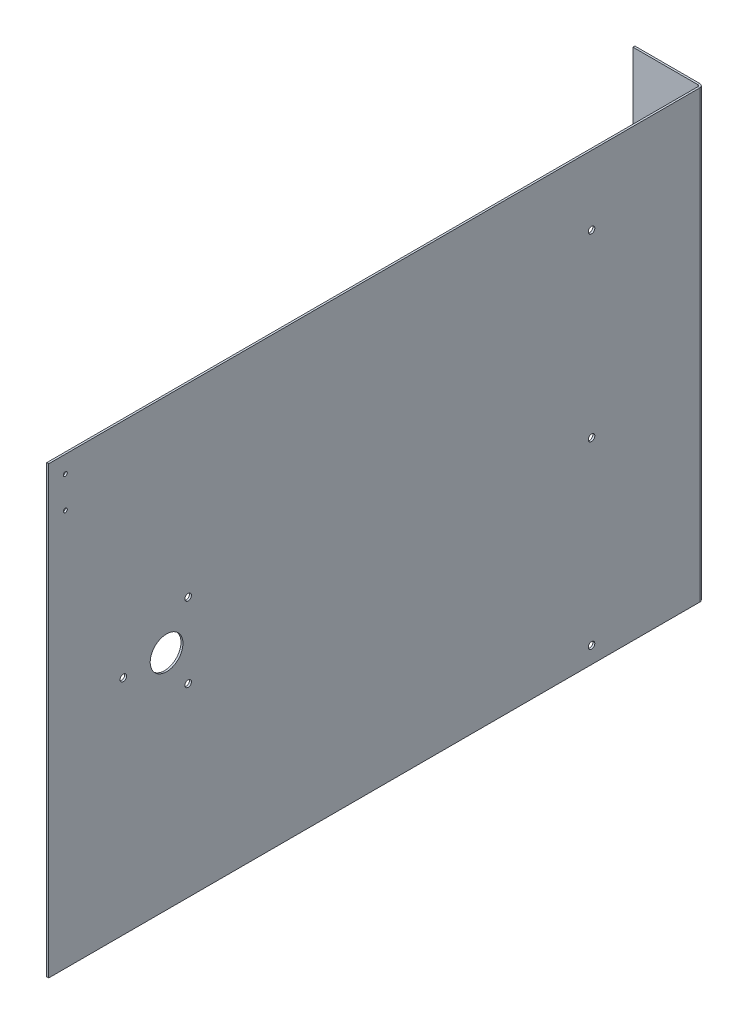
ISO-10303-21;
HEADER;
FILE_DESCRIPTION(('STEP AP214'),'2;1');
FILE_NAME('part.step','',(''),(''),'','','');
FILE_SCHEMA(('AUTOMOTIVE_DESIGN { 1 0 10303 214 1 1 1 1 }'));
ENDSEC;
DATA;
#1=APPLICATION_CONTEXT('core data for automotive mechanical design processes');
#2=APPLICATION_PROTOCOL_DEFINITION('international standard','automotive_design',2000,#1);
#3=PRODUCT_CONTEXT('',#1,'mechanical');
#4=PRODUCT('Part','Part','',(#3));
#5=PRODUCT_RELATED_PRODUCT_CATEGORY('part','',(#4));
#6=PRODUCT_DEFINITION_FORMATION('','',#4);
#7=PRODUCT_DEFINITION_CONTEXT('part definition',#1,'design');
#8=PRODUCT_DEFINITION('design','',#6,#7);
#9=PRODUCT_DEFINITION_SHAPE('','',#8);
#10=(LENGTH_UNIT() NAMED_UNIT(*) SI_UNIT(.MILLI.,.METRE.));
#11=(NAMED_UNIT(*) PLANE_ANGLE_UNIT() SI_UNIT($,.RADIAN.));
#12=(NAMED_UNIT(*) SI_UNIT($,.STERADIAN.) SOLID_ANGLE_UNIT());
#13=UNCERTAINTY_MEASURE_WITH_UNIT(LENGTH_MEASURE(1.E-05),#10,'distance_accuracy_value','');
#14=(GEOMETRIC_REPRESENTATION_CONTEXT(3) GLOBAL_UNCERTAINTY_ASSIGNED_CONTEXT((#13)) GLOBAL_UNIT_ASSIGNED_CONTEXT((#10,
#11,#12)) REPRESENTATION_CONTEXT('',''));
#15=CARTESIAN_POINT('',(0.,0.,0.));
#16=DIRECTION('',(0.,0.,1.));
#17=DIRECTION('',(1.,0.,0.));
#18=AXIS2_PLACEMENT_3D('',#15,#16,#17);
#19=CARTESIAN_POINT('',(-51.1657082647115,-170.,-225.));
#20=DIRECTION('',(0.,1.,0.));
#21=DIRECTION('',(1.,0.,0.));
#22=AXIS2_PLACEMENT_3D('',#19,#20,#21);
#23=PLANE('',#22);
#24=DIRECTION('',(1.,0.,0.));
#25=VECTOR('',#24,1.);
#26=CARTESIAN_POINT('',(-51.1657082647115,-170.,-225.));
#27=LINE('',#26,#25);
#28=CARTESIAN_POINT('',(-51.1657082647115,-170.,-225.));
#29=VERTEX_POINT('',#28);
#30=CARTESIAN_POINT('',(-1.70000000000001,-170.,-225.));
#31=VERTEX_POINT('',#30);
#32=EDGE_CURVE('E1603',#29,#31,#27,.T.);
#33=ORIENTED_EDGE('',*,*,#32,.T.);
#34=DIRECTION('',(0.,0.,1.));
#35=VECTOR('',#34,1.);
#36=CARTESIAN_POINT('',(-1.70000000000001,-170.,-225.));
#37=LINE('',#36,#35);
#38=CARTESIAN_POINT('',(-1.7,-170.,-223.5));
#39=VERTEX_POINT('',#38);
#40=EDGE_CURVE('E12',#31,#39,#37,.T.);
#41=ORIENTED_EDGE('',*,*,#40,.T.);
#42=DIRECTION('',(-1.,0.,0.));
#43=VECTOR('',#42,1.);
#44=CARTESIAN_POINT('',(223.834291735289,-170.,-223.500000000001));
#45=LINE('',#44,#43);
#46=CARTESIAN_POINT('',(-51.1657082647115,-170.,-223.5));
#47=VERTEX_POINT('',#46);
#48=EDGE_CURVE('E1591',#47,#39,#45,.F.);
#49=ORIENTED_EDGE('',*,*,#48,.F.);
#50=DIRECTION('',(0.,0.,-1.));
#51=VECTOR('',#50,1.);
#52=CARTESIAN_POINT('',(-51.1657082647115,-170.,-225.));
#53=LINE('',#52,#51);
#54=EDGE_CURVE('E1509',#47,#29,#53,.T.);
#55=ORIENTED_EDGE('',*,*,#54,.T.);
#56=EDGE_LOOP('',(#33,#41,#49,#55));
#57=FACE_BOUND('',#56,.T.);
#58=ADVANCED_FACE('F1482',(#57),#23,.F.);
#59=CARTESIAN_POINT('',(-51.1657082647115,170.,-225.));
#60=DIRECTION('',(0.,1.,0.));
#61=DIRECTION('',(1.,0.,0.));
#62=AXIS2_PLACEMENT_3D('',#59,#60,#61);
#63=PLANE('',#62);
#64=DIRECTION('',(-1.,0.,0.));
#65=VECTOR('',#64,1.);
#66=CARTESIAN_POINT('',(223.834291735289,170.,-223.500000000001));
#67=LINE('',#66,#65);
#68=CARTESIAN_POINT('',(-51.1657082647115,170.,-223.5));
#69=VERTEX_POINT('',#68);
#70=CARTESIAN_POINT('',(-1.7,170.,-223.5));
#71=VERTEX_POINT('',#70);
#72=EDGE_CURVE('E1597',#69,#71,#67,.F.);
#73=ORIENTED_EDGE('',*,*,#72,.T.);
#74=DIRECTION('',(0.,0.,-1.));
#75=VECTOR('',#74,1.);
#76=CARTESIAN_POINT('',(-1.70000000000001,170.,-225.));
#77=LINE('',#76,#75);
#78=CARTESIAN_POINT('',(-1.7,170.,-225.));
#79=VERTEX_POINT('',#78);
#80=EDGE_CURVE('E1566',#71,#79,#77,.T.);
#81=ORIENTED_EDGE('',*,*,#80,.T.);
#82=DIRECTION('',(1.,0.,0.));
#83=VECTOR('',#82,1.);
#84=CARTESIAN_POINT('',(-51.1657082647115,170.,-225.));
#85=LINE('',#84,#83);
#86=CARTESIAN_POINT('',(-51.1657082647115,170.,-225.));
#87=VERTEX_POINT('',#86);
#88=EDGE_CURVE('E1610',#87,#79,#85,.T.);
#89=ORIENTED_EDGE('',*,*,#88,.F.);
#90=DIRECTION('',(0.,0.,-1.));
#91=VECTOR('',#90,1.);
#92=CARTESIAN_POINT('',(-51.1657082647115,170.,-225.));
#93=LINE('',#92,#91);
#94=EDGE_CURVE('E1525',#69,#87,#93,.T.);
#95=ORIENTED_EDGE('',*,*,#94,.F.);
#96=EDGE_LOOP('',(#73,#81,#89,#95));
#97=FACE_BOUND('',#96,.T.);
#98=ADVANCED_FACE('F1771',(#97),#63,.T.);
#99=CARTESIAN_POINT('',(223.834291735289,0.,-225.000000000001));
#100=DIRECTION('',(0.,0.,-1.));
#101=DIRECTION('',(-1.,0.,0.));
#102=AXIS2_PLACEMENT_3D('',#99,#100,#101);
#103=PLANE('',#102);
#104=CARTESIAN_POINT('',(-26.1657082647114,-140.,-225.));
#105=DIRECTION('',(0.,0.,-1.));
#106=DIRECTION('',(-1.,0.,0.));
#107=AXIS2_PLACEMENT_3D('',#104,#105,#106);
#108=CIRCLE('',#107,2.5);
#109=CARTESIAN_POINT('',(-28.6657082647114,-140.,-225.));
#110=VERTEX_POINT('',#109);
#111=EDGE_CURVE('E1747',#110,#110,#108,.T.);
#112=ORIENTED_EDGE('',*,*,#111,.F.);
#113=EDGE_LOOP('',(#112));
#114=FACE_BOUND('',#113,.T.);
#115=CARTESIAN_POINT('',(-26.1657082647114,0.,-225.));
#116=DIRECTION('',(0.,0.,-1.));
#117=DIRECTION('',(-1.,0.,0.));
#118=AXIS2_PLACEMENT_3D('',#115,#116,#117);
#119=CIRCLE('',#118,2.49999999999999);
#120=CARTESIAN_POINT('',(-28.6657082647114,0.,-225.));
#121=VERTEX_POINT('',#120);
#122=EDGE_CURVE('E1745',#121,#121,#119,.T.);
#123=ORIENTED_EDGE('',*,*,#122,.F.);
#124=EDGE_LOOP('',(#123));
#125=FACE_BOUND('',#124,.T.);
#126=CARTESIAN_POINT('',(-26.1657082647114,140.,-225.));
#127=DIRECTION('',(0.,0.,-1.));
#128=DIRECTION('',(-1.,0.,0.));
#129=AXIS2_PLACEMENT_3D('',#126,#127,#128);
#130=CIRCLE('',#129,2.5);
#131=CARTESIAN_POINT('',(-28.6657082647114,140.,-225.));
#132=VERTEX_POINT('',#131);
#133=EDGE_CURVE('E1599',#132,#132,#130,.T.);
#134=ORIENTED_EDGE('',*,*,#133,.F.);
#135=EDGE_LOOP('',(#134));
#136=FACE_BOUND('',#135,.T.);
#137=ORIENTED_EDGE('',*,*,#88,.T.);
#138=DIRECTION('',(0.,-1.,0.));
#139=VECTOR('',#138,1.);
#140=CARTESIAN_POINT('',(-1.70000000000001,0.,-225.));
#141=LINE('',#140,#139);
#142=EDGE_CURVE('E1767',#79,#31,#141,.T.);
#143=ORIENTED_EDGE('',*,*,#142,.T.);
#144=ORIENTED_EDGE('',*,*,#32,.F.);
#145=DIRECTION('',(0.,1.,0.));
#146=VECTOR('',#145,1.);
#147=CARTESIAN_POINT('',(-51.1657082647115,-170.,-225.));
#148=LINE('',#147,#146);
#149=EDGE_CURVE('E1613',#29,#87,#148,.T.);
#150=ORIENTED_EDGE('',*,*,#149,.T.);
#151=EDGE_LOOP('',(#137,#143,#144,#150));
#152=FACE_BOUND('',#151,.T.);
#153=ADVANCED_FACE('F1772',(#114,#125,#136,#152),#103,.T.);
#154=CARTESIAN_POINT('',(-51.1657082647115,-170.,-225.));
#155=DIRECTION('',(-1.,0.,0.));
#156=DIRECTION('',(0.,1.,0.));
#157=AXIS2_PLACEMENT_3D('',#154,#155,#156);
#158=PLANE('',#157);
#159=ORIENTED_EDGE('',*,*,#54,.F.);
#160=DIRECTION('',(0.,1.,0.));
#161=VECTOR('',#160,1.);
#162=CARTESIAN_POINT('',(-51.1657082647115,0.,-223.5));
#163=LINE('',#162,#161);
#164=EDGE_CURVE('E1600',#47,#69,#163,.T.);
#165=ORIENTED_EDGE('',*,*,#164,.T.);
#166=ORIENTED_EDGE('',*,*,#94,.T.);
#167=ORIENTED_EDGE('',*,*,#149,.F.);
#168=EDGE_LOOP('',(#159,#165,#166,#167));
#169=FACE_BOUND('',#168,.T.);
#170=ADVANCED_FACE('F1773',(#169),#158,.T.);
#171=CARTESIAN_POINT('',(-26.1657082647114,140.,-225.));
#172=DIRECTION('',(0.,0.,-1.));
#173=DIRECTION('',(-1.,0.,0.));
#174=AXIS2_PLACEMENT_3D('',#171,#172,#173);
#175=CYLINDRICAL_SURFACE('',#174,2.5);
#176=ORIENTED_EDGE('',*,*,#133,.T.);
#177=EDGE_LOOP('',(#176));
#178=FACE_BOUND('',#177,.T.);
#179=CARTESIAN_POINT('',(-26.1657082647114,140.,-223.5));
#180=DIRECTION('',(0.,0.,-1.));
#181=DIRECTION('',(-1.,0.,0.));
#182=AXIS2_PLACEMENT_3D('',#179,#180,#181);
#183=CIRCLE('',#182,2.5);
#184=CARTESIAN_POINT('',(-28.6657082647114,140.,-223.5));
#185=VERTEX_POINT('',#184);
#186=EDGE_CURVE('E1679',#185,#185,#183,.T.);
#187=ORIENTED_EDGE('',*,*,#186,.F.);
#188=EDGE_LOOP('',(#187));
#189=FACE_BOUND('',#188,.T.);
#190=ADVANCED_FACE('F1842',(#178,#189),#175,.F.);
#191=CARTESIAN_POINT('',(-26.1657082647114,0.,-225.));
#192=DIRECTION('',(0.,0.,-1.));
#193=DIRECTION('',(-1.,0.,0.));
#194=AXIS2_PLACEMENT_3D('',#191,#192,#193);
#195=CYLINDRICAL_SURFACE('',#194,2.49999999999999);
#196=ORIENTED_EDGE('',*,*,#122,.T.);
#197=EDGE_LOOP('',(#196));
#198=FACE_BOUND('',#197,.T.);
#199=CARTESIAN_POINT('',(-26.1657082647114,0.,-223.5));
#200=DIRECTION('',(0.,0.,-1.));
#201=DIRECTION('',(-1.,0.,0.));
#202=AXIS2_PLACEMENT_3D('',#199,#200,#201);
#203=CIRCLE('',#202,2.49999999999999);
#204=CARTESIAN_POINT('',(-28.6657082647114,0.,-223.5));
#205=VERTEX_POINT('',#204);
#206=EDGE_CURVE('E1752',#205,#205,#203,.T.);
#207=ORIENTED_EDGE('',*,*,#206,.F.);
#208=EDGE_LOOP('',(#207));
#209=FACE_BOUND('',#208,.T.);
#210=ADVANCED_FACE('F1838',(#198,#209),#195,.F.);
#211=CARTESIAN_POINT('',(-26.1657082647114,-140.,-225.));
#212=DIRECTION('',(0.,0.,-1.));
#213=DIRECTION('',(-1.,0.,0.));
#214=AXIS2_PLACEMENT_3D('',#211,#212,#213);
#215=CYLINDRICAL_SURFACE('',#214,2.5);
#216=ORIENTED_EDGE('',*,*,#111,.T.);
#217=EDGE_LOOP('',(#216));
#218=FACE_BOUND('',#217,.T.);
#219=CARTESIAN_POINT('',(-26.1657082647114,-140.,-223.5));
#220=DIRECTION('',(0.,0.,-1.));
#221=DIRECTION('',(-1.,0.,0.));
#222=AXIS2_PLACEMENT_3D('',#219,#220,#221);
#223=CIRCLE('',#222,2.5);
#224=CARTESIAN_POINT('',(-28.6657082647114,-140.,-223.5));
#225=VERTEX_POINT('',#224);
#226=EDGE_CURVE('E1758',#225,#225,#223,.T.);
#227=ORIENTED_EDGE('',*,*,#226,.F.);
#228=EDGE_LOOP('',(#227));
#229=FACE_BOUND('',#228,.T.);
#230=ADVANCED_FACE('F1833',(#218,#229),#215,.F.);
#231=CARTESIAN_POINT('',(223.834291735289,0.,-223.500000000001));
#232=DIRECTION('',(0.,0.,-1.));
#233=DIRECTION('',(-1.,0.,0.));
#234=AXIS2_PLACEMENT_3D('',#231,#232,#233);
#235=PLANE('',#234);
#236=DIRECTION('',(0.,-1.,0.));
#237=VECTOR('',#236,1.);
#238=CARTESIAN_POINT('',(-1.70000000000001,0.,-223.5));
#239=LINE('',#238,#237);
#240=EDGE_CURVE('E1491',#71,#39,#239,.T.);
#241=ORIENTED_EDGE('',*,*,#240,.F.);
#242=ORIENTED_EDGE('',*,*,#72,.F.);
#243=ORIENTED_EDGE('',*,*,#164,.F.);
#244=ORIENTED_EDGE('',*,*,#48,.T.);
#245=EDGE_LOOP('',(#241,#242,#243,#244));
#246=FACE_BOUND('',#245,.T.);
#247=ORIENTED_EDGE('',*,*,#186,.T.);
#248=EDGE_LOOP('',(#247));
#249=FACE_BOUND('',#248,.T.);
#250=ORIENTED_EDGE('',*,*,#206,.T.);
#251=EDGE_LOOP('',(#250));
#252=FACE_BOUND('',#251,.T.);
#253=ORIENTED_EDGE('',*,*,#226,.T.);
#254=EDGE_LOOP('',(#253));
#255=FACE_BOUND('',#254,.T.);
#256=ADVANCED_FACE('F1595',(#246,#249,#252,#255),#235,.F.);
#257=CARTESIAN_POINT('',(1.3,117.3,-139.45));
#258=DIRECTION('',(1.,0.,0.));
#259=DIRECTION('',(0.,0.,-1.));
#260=AXIS2_PLACEMENT_3D('',#257,#258,#259);
#261=CYLINDRICAL_SURFACE('',#260,2.49999999999999);
#262=CARTESIAN_POINT('',(1.3,117.3,-139.45));
#263=DIRECTION('',(1.,0.,0.));
#264=DIRECTION('',(0.,0.,-1.));
#265=AXIS2_PLACEMENT_3D('',#262,#263,#264);
#266=CIRCLE('',#265,2.49999999999999);
#267=CARTESIAN_POINT('',(1.3,117.3,-141.95));
#268=VERTEX_POINT('',#267);
#269=EDGE_CURVE('E1730',#268,#268,#266,.T.);
#270=ORIENTED_EDGE('',*,*,#269,.T.);
#271=EDGE_LOOP('',(#270));
#272=FACE_BOUND('',#271,.T.);
#273=CARTESIAN_POINT('',(-0.199999999999999,117.3,-139.45));
#274=DIRECTION('',(1.,0.,0.));
#275=DIRECTION('',(0.,0.,-1.));
#276=AXIS2_PLACEMENT_3D('',#273,#274,#275);
#277=CIRCLE('',#276,2.49999999999999);
#278=CARTESIAN_POINT('',(-0.199999999999999,117.3,-141.95));
#279=VERTEX_POINT('',#278);
#280=EDGE_CURVE('E1698',#279,#279,#277,.T.);
#281=ORIENTED_EDGE('',*,*,#280,.F.);
#282=EDGE_LOOP('',(#281));
#283=FACE_BOUND('',#282,.T.);
#284=ADVANCED_FACE('F1796',(#272,#283),#261,.F.);
#285=CARTESIAN_POINT('',(1.3,-19.9999999999999,-139.45));
#286=DIRECTION('',(1.,0.,0.));
#287=DIRECTION('',(0.,0.,-1.));
#288=AXIS2_PLACEMENT_3D('',#285,#286,#287);
#289=CYLINDRICAL_SURFACE('',#288,2.49999999999999);
#290=CARTESIAN_POINT('',(1.3,-19.9999999999999,-139.45));
#291=DIRECTION('',(1.,0.,0.));
#292=DIRECTION('',(0.,0.,-1.));
#293=AXIS2_PLACEMENT_3D('',#290,#291,#292);
#294=CIRCLE('',#293,2.49999999999999);
#295=CARTESIAN_POINT('',(1.3,-19.9999999999999,-141.95));
#296=VERTEX_POINT('',#295);
#297=EDGE_CURVE('E1721',#296,#296,#294,.T.);
#298=ORIENTED_EDGE('',*,*,#297,.T.);
#299=EDGE_LOOP('',(#298));
#300=FACE_BOUND('',#299,.T.);
#301=CARTESIAN_POINT('',(-0.199999999999999,-19.9999999999999,-139.45));
#302=DIRECTION('',(1.,0.,0.));
#303=DIRECTION('',(0.,0.,-1.));
#304=AXIS2_PLACEMENT_3D('',#301,#302,#303);
#305=CIRCLE('',#304,2.49999999999999);
#306=CARTESIAN_POINT('',(-0.199999999999999,-19.9999999999999,-141.95));
#307=VERTEX_POINT('',#306);
#308=EDGE_CURVE('E1697',#307,#307,#305,.T.);
#309=ORIENTED_EDGE('',*,*,#308,.F.);
#310=EDGE_LOOP('',(#309));
#311=FACE_BOUND('',#310,.T.);
#312=ADVANCED_FACE('F1797',(#300,#311),#289,.F.);
#313=CARTESIAN_POINT('',(1.3,-157.3,-139.45));
#314=DIRECTION('',(1.,0.,0.));
#315=DIRECTION('',(0.,0.,-1.));
#316=AXIS2_PLACEMENT_3D('',#313,#314,#315);
#317=CYLINDRICAL_SURFACE('',#316,2.5);
#318=CARTESIAN_POINT('',(1.3,-157.3,-139.45));
#319=DIRECTION('',(1.,0.,0.));
#320=DIRECTION('',(0.,0.,-1.));
#321=AXIS2_PLACEMENT_3D('',#318,#319,#320);
#322=CIRCLE('',#321,2.5);
#323=CARTESIAN_POINT('',(1.3,-157.3,-141.95));
#324=VERTEX_POINT('',#323);
#325=EDGE_CURVE('E1719',#324,#324,#322,.T.);
#326=ORIENTED_EDGE('',*,*,#325,.T.);
#327=EDGE_LOOP('',(#326));
#328=FACE_BOUND('',#327,.T.);
#329=CARTESIAN_POINT('',(-0.199999999999999,-157.3,-139.45));
#330=DIRECTION('',(1.,0.,0.));
#331=DIRECTION('',(0.,0.,-1.));
#332=AXIS2_PLACEMENT_3D('',#329,#330,#331);
#333=CIRCLE('',#332,2.5);
#334=CARTESIAN_POINT('',(-0.199999999999999,-157.3,-141.95));
#335=VERTEX_POINT('',#334);
#336=EDGE_CURVE('E1695',#335,#335,#333,.T.);
#337=ORIENTED_EDGE('',*,*,#336,.F.);
#338=EDGE_LOOP('',(#337));
#339=FACE_BOUND('',#338,.T.);
#340=ADVANCED_FACE('F1815',(#328,#339),#317,.F.);
#341=CARTESIAN_POINT('',(1.3,-170.,275.));
#342=DIRECTION('',(0.,0.,-1.));
#343=DIRECTION('',(0.,1.,0.));
#344=AXIS2_PLACEMENT_3D('',#341,#342,#343);
#345=PLANE('',#344);
#346=DIRECTION('',(1.,0.,0.));
#347=VECTOR('',#346,1.);
#348=CARTESIAN_POINT('',(1.3,170.,275.));
#349=LINE('',#348,#347);
#350=CARTESIAN_POINT('',(-0.2,170.,275.));
#351=VERTEX_POINT('',#350);
#352=CARTESIAN_POINT('',(1.3,170.,275.));
#353=VERTEX_POINT('',#352);
#354=EDGE_CURVE('E1704',#351,#353,#349,.T.);
#355=ORIENTED_EDGE('',*,*,#354,.F.);
#356=DIRECTION('',(0.,1.,0.));
#357=VECTOR('',#356,1.);
#358=CARTESIAN_POINT('',(-0.2,0.,275.));
#359=LINE('',#358,#357);
#360=CARTESIAN_POINT('',(-0.2,-170.,275.));
#361=VERTEX_POINT('',#360);
#362=EDGE_CURVE('E1682',#361,#351,#359,.T.);
#363=ORIENTED_EDGE('',*,*,#362,.F.);
#364=DIRECTION('',(1.,0.,0.));
#365=VECTOR('',#364,1.);
#366=CARTESIAN_POINT('',(1.3,-170.,275.));
#367=LINE('',#366,#365);
#368=CARTESIAN_POINT('',(1.3,-170.,275.));
#369=VERTEX_POINT('',#368);
#370=EDGE_CURVE('E1718',#361,#369,#367,.T.);
#371=ORIENTED_EDGE('',*,*,#370,.T.);
#372=DIRECTION('',(0.,1.,0.));
#373=VECTOR('',#372,1.);
#374=CARTESIAN_POINT('',(1.3,-170.,275.));
#375=LINE('',#374,#373);
#376=EDGE_CURVE('E1711',#369,#353,#375,.T.);
#377=ORIENTED_EDGE('',*,*,#376,.T.);
#378=EDGE_LOOP('',(#355,#363,#371,#377));
#379=FACE_BOUND('',#378,.T.);
#380=ADVANCED_FACE('F1784',(#379),#345,.F.);
#381=CARTESIAN_POINT('',(1.3,0.,0.));
#382=DIRECTION('',(1.,0.,0.));
#383=DIRECTION('',(0.,0.,-1.));
#384=AXIS2_PLACEMENT_3D('',#381,#382,#383);
#385=PLANE('',#384);
#386=CARTESIAN_POINT('',(1.3,156.891480577066,262.3));
#387=DIRECTION('',(1.,0.,0.));
#388=DIRECTION('',(0.,0.,-1.));
#389=AXIS2_PLACEMENT_3D('',#386,#387,#388);
#390=CIRCLE('',#389,1.49999999999997);
#391=CARTESIAN_POINT('',(1.3,156.891480577066,260.8));
#392=VERTEX_POINT('',#391);
#393=EDGE_CURVE('E1630',#392,#392,#390,.T.);
#394=ORIENTED_EDGE('',*,*,#393,.F.);
#395=EDGE_LOOP('',(#394));
#396=FACE_BOUND('',#395,.T.);
#397=CARTESIAN_POINT('',(1.3,132.789034573881,262.3));
#398=DIRECTION('',(1.,0.,0.));
#399=DIRECTION('',(0.,0.,-1.));
#400=AXIS2_PLACEMENT_3D('',#397,#398,#399);
#401=CIRCLE('',#400,1.49999999999997);
#402=CARTESIAN_POINT('',(1.3,132.789034573881,260.8));
#403=VERTEX_POINT('',#402);
#404=EDGE_CURVE('E1633',#403,#403,#401,.T.);
#405=ORIENTED_EDGE('',*,*,#404,.F.);
#406=EDGE_LOOP('',(#405));
#407=FACE_BOUND('',#406,.T.);
#408=CARTESIAN_POINT('',(1.3,0.,185.));
#409=DIRECTION('',(1.,0.,0.));
#410=DIRECTION('',(0.,0.,-1.));
#411=AXIS2_PLACEMENT_3D('',#408,#409,#410);
#412=CIRCLE('',#411,12.5);
#413=CARTESIAN_POINT('',(1.3,0.,172.5));
#414=VERTEX_POINT('',#413);
#415=EDGE_CURVE('E1625',#414,#414,#412,.T.);
#416=ORIENTED_EDGE('',*,*,#415,.F.);
#417=EDGE_LOOP('',(#416));
#418=FACE_BOUND('',#417,.T.);
#419=CARTESIAN_POINT('',(1.3,0.,218.));
#420=DIRECTION('',(1.,0.,0.));
#421=DIRECTION('',(0.,0.,-1.));
#422=AXIS2_PLACEMENT_3D('',#419,#420,#421);
#423=CIRCLE('',#422,2.5);
#424=CARTESIAN_POINT('',(1.3,0.,215.5));
#425=VERTEX_POINT('',#424);
#426=EDGE_CURVE('E1621',#425,#425,#423,.T.);
#427=ORIENTED_EDGE('',*,*,#426,.F.);
#428=EDGE_LOOP('',(#427));
#429=FACE_BOUND('',#428,.T.);
#430=CARTESIAN_POINT('',(1.3,28.5788383248864,168.5));
#431=DIRECTION('',(1.,0.,0.));
#432=DIRECTION('',(0.,0.,-1.));
#433=AXIS2_PLACEMENT_3D('',#430,#431,#432);
#434=CIRCLE('',#433,2.5);
#435=CARTESIAN_POINT('',(1.3,28.5788383248864,166.));
#436=VERTEX_POINT('',#435);
#437=EDGE_CURVE('E1654',#436,#436,#434,.T.);
#438=ORIENTED_EDGE('',*,*,#437,.F.);
#439=EDGE_LOOP('',(#438));
#440=FACE_BOUND('',#439,.T.);
#441=CARTESIAN_POINT('',(1.3,-28.5788383248864,168.5));
#442=DIRECTION('',(1.,0.,0.));
#443=DIRECTION('',(0.,0.,-1.));
#444=AXIS2_PLACEMENT_3D('',#441,#442,#443);
#445=CIRCLE('',#444,2.5);
#446=CARTESIAN_POINT('',(1.3,-28.5788383248864,166.));
#447=VERTEX_POINT('',#446);
#448=EDGE_CURVE('E1665',#447,#447,#445,.T.);
#449=ORIENTED_EDGE('',*,*,#448,.F.);
#450=EDGE_LOOP('',(#449));
#451=FACE_BOUND('',#450,.T.);
#452=DIRECTION('',(0.,-1.,0.));
#453=VECTOR('',#452,1.);
#454=CARTESIAN_POINT('',(1.3,0.,-222.));
#455=LINE('',#454,#453);
#456=CARTESIAN_POINT('',(1.3,170.,-222.));
#457=VERTEX_POINT('',#456);
#458=CARTESIAN_POINT('',(1.3,-170.,-222.));
#459=VERTEX_POINT('',#458);
#460=EDGE_CURVE('E1674',#457,#459,#455,.T.);
#461=ORIENTED_EDGE('',*,*,#460,.F.);
#462=DIRECTION('',(0.,0.,1.));
#463=VECTOR('',#462,1.);
#464=CARTESIAN_POINT('',(1.3,170.,-275.));
#465=LINE('',#464,#463);
#466=EDGE_CURVE('E1561',#457,#353,#465,.T.);
#467=ORIENTED_EDGE('',*,*,#466,.T.);
#468=ORIENTED_EDGE('',*,*,#376,.F.);
#469=DIRECTION('',(0.,0.,1.));
#470=VECTOR('',#469,1.);
#471=CARTESIAN_POINT('',(1.3,-170.,-275.));
#472=LINE('',#471,#470);
#473=EDGE_CURVE('E1533',#459,#369,#472,.T.);
#474=ORIENTED_EDGE('',*,*,#473,.F.);
#475=EDGE_LOOP('',(#461,#467,#468,#474));
#476=FACE_BOUND('',#475,.T.);
#477=ORIENTED_EDGE('',*,*,#325,.F.);
#478=EDGE_LOOP('',(#477));
#479=FACE_BOUND('',#478,.T.);
#480=ORIENTED_EDGE('',*,*,#297,.F.);
#481=EDGE_LOOP('',(#480));
#482=FACE_BOUND('',#481,.T.);
#483=ORIENTED_EDGE('',*,*,#269,.F.);
#484=EDGE_LOOP('',(#483));
#485=FACE_BOUND('',#484,.T.);
#486=ADVANCED_FACE('F1782',(#396,#407,#418,#429,#440,#451,#476,#479,#482,#485),#385,.T.);
#487=CARTESIAN_POINT('',(1.3,170.,-275.));
#488=DIRECTION('',(0.,1.,0.));
#489=DIRECTION('',(0.,0.,1.));
#490=AXIS2_PLACEMENT_3D('',#487,#488,#489);
#491=PLANE('',#490);
#492=DIRECTION('',(1.,0.,0.));
#493=VECTOR('',#492,1.);
#494=CARTESIAN_POINT('',(1.3,170.,-222.));
#495=LINE('',#494,#493);
#496=CARTESIAN_POINT('',(-0.2,170.,-222.));
#497=VERTEX_POINT('',#496);
#498=EDGE_CURVE('E1731',#497,#457,#495,.T.);
#499=ORIENTED_EDGE('',*,*,#498,.F.);
#500=DIRECTION('',(0.,0.,-1.));
#501=VECTOR('',#500,1.);
#502=CARTESIAN_POINT('',(-0.2,170.,0.));
#503=LINE('',#502,#501);
#504=EDGE_CURVE('E1706',#497,#351,#503,.F.);
#505=ORIENTED_EDGE('',*,*,#504,.T.);
#506=ORIENTED_EDGE('',*,*,#354,.T.);
#507=ORIENTED_EDGE('',*,*,#466,.F.);
#508=EDGE_LOOP('',(#499,#505,#506,#507));
#509=FACE_BOUND('',#508,.T.);
#510=ADVANCED_FACE('F1780',(#509),#491,.T.);
#511=CARTESIAN_POINT('',(-0.2,0.,0.));
#512=DIRECTION('',(1.,0.,0.));
#513=DIRECTION('',(0.,0.,-1.));
#514=AXIS2_PLACEMENT_3D('',#511,#512,#513);
#515=PLANE('',#514);
#516=CARTESIAN_POINT('',(-0.199999999999999,156.891480577066,262.3));
#517=DIRECTION('',(1.,0.,0.));
#518=DIRECTION('',(0.,0.,-1.));
#519=AXIS2_PLACEMENT_3D('',#516,#517,#518);
#520=CIRCLE('',#519,1.49999999999997);
#521=CARTESIAN_POINT('',(-0.199999999999999,156.891480577066,260.8));
#522=VERTEX_POINT('',#521);
#523=EDGE_CURVE('E1487',#522,#522,#520,.T.);
#524=ORIENTED_EDGE('',*,*,#523,.T.);
#525=EDGE_LOOP('',(#524));
#526=FACE_BOUND('',#525,.T.);
#527=CARTESIAN_POINT('',(-0.199999999999999,132.789034573881,262.3));
#528=DIRECTION('',(1.,0.,0.));
#529=DIRECTION('',(0.,0.,-1.));
#530=AXIS2_PLACEMENT_3D('',#527,#528,#529);
#531=CIRCLE('',#530,1.49999999999997);
#532=CARTESIAN_POINT('',(-0.199999999999999,132.789034573881,260.8));
#533=VERTEX_POINT('',#532);
#534=EDGE_CURVE('E1623',#533,#533,#531,.T.);
#535=ORIENTED_EDGE('',*,*,#534,.T.);
#536=EDGE_LOOP('',(#535));
#537=FACE_BOUND('',#536,.T.);
#538=CARTESIAN_POINT('',(-0.199999999999999,0.,185.));
#539=DIRECTION('',(1.,0.,0.));
#540=DIRECTION('',(0.,0.,-1.));
#541=AXIS2_PLACEMENT_3D('',#538,#539,#540);
#542=CIRCLE('',#541,12.5);
#543=CARTESIAN_POINT('',(-0.199999999999999,0.,172.5));
#544=VERTEX_POINT('',#543);
#545=EDGE_CURVE('E1616',#544,#544,#542,.T.);
#546=ORIENTED_EDGE('',*,*,#545,.T.);
#547=EDGE_LOOP('',(#546));
#548=FACE_BOUND('',#547,.T.);
#549=CARTESIAN_POINT('',(-0.2,0.,218.));
#550=DIRECTION('',(1.,0.,0.));
#551=DIRECTION('',(0.,0.,-1.));
#552=AXIS2_PLACEMENT_3D('',#549,#550,#551);
#553=CIRCLE('',#552,2.5);
#554=CARTESIAN_POINT('',(-0.2,0.,215.5));
#555=VERTEX_POINT('',#554);
#556=EDGE_CURVE('E1647',#555,#555,#553,.T.);
#557=ORIENTED_EDGE('',*,*,#556,.T.);
#558=EDGE_LOOP('',(#557));
#559=FACE_BOUND('',#558,.T.);
#560=CARTESIAN_POINT('',(-0.2,28.5788383248864,168.5));
#561=DIRECTION('',(1.,0.,0.));
#562=DIRECTION('',(0.,0.,-1.));
#563=AXIS2_PLACEMENT_3D('',#560,#561,#562);
#564=CIRCLE('',#563,2.5);
#565=CARTESIAN_POINT('',(-0.2,28.5788383248864,166.));
#566=VERTEX_POINT('',#565);
#567=EDGE_CURVE('E1656',#566,#566,#564,.T.);
#568=ORIENTED_EDGE('',*,*,#567,.T.);
#569=EDGE_LOOP('',(#568));
#570=FACE_BOUND('',#569,.T.);
#571=CARTESIAN_POINT('',(-0.2,-28.5788383248864,168.5));
#572=DIRECTION('',(1.,0.,0.));
#573=DIRECTION('',(0.,0.,-1.));
#574=AXIS2_PLACEMENT_3D('',#571,#572,#573);
#575=CIRCLE('',#574,2.5);
#576=CARTESIAN_POINT('',(-0.2,-28.5788383248864,166.));
#577=VERTEX_POINT('',#576);
#578=EDGE_CURVE('E1666',#577,#577,#575,.T.);
#579=ORIENTED_EDGE('',*,*,#578,.T.);
#580=EDGE_LOOP('',(#579));
#581=FACE_BOUND('',#580,.T.);
#582=ORIENTED_EDGE('',*,*,#280,.T.);
#583=EDGE_LOOP('',(#582));
#584=FACE_BOUND('',#583,.T.);
#585=ORIENTED_EDGE('',*,*,#308,.T.);
#586=EDGE_LOOP('',(#585));
#587=FACE_BOUND('',#586,.T.);
#588=ORIENTED_EDGE('',*,*,#336,.T.);
#589=EDGE_LOOP('',(#588));
#590=FACE_BOUND('',#589,.T.);
#591=ORIENTED_EDGE('',*,*,#504,.F.);
#592=DIRECTION('',(0.,-1.,0.));
#593=VECTOR('',#592,1.);
#594=CARTESIAN_POINT('',(-0.2,0.,-222.));
#595=LINE('',#594,#593);
#596=CARTESIAN_POINT('',(-0.2,-170.,-222.));
#597=VERTEX_POINT('',#596);
#598=EDGE_CURVE('E1690',#497,#597,#595,.T.);
#599=ORIENTED_EDGE('',*,*,#598,.T.);
#600=DIRECTION('',(0.,0.,-1.));
#601=VECTOR('',#600,1.);
#602=CARTESIAN_POINT('',(-0.2,-170.,0.));
#603=LINE('',#602,#601);
#604=EDGE_CURVE('E1683',#597,#361,#603,.F.);
#605=ORIENTED_EDGE('',*,*,#604,.T.);
#606=ORIENTED_EDGE('',*,*,#362,.T.);
#607=EDGE_LOOP('',(#591,#599,#605,#606));
#608=FACE_BOUND('',#607,.T.);
#609=ADVANCED_FACE('F1783',(#526,#537,#548,#559,#570,#581,#584,#587,#590,#608),#515,.F.);
#610=CARTESIAN_POINT('',(1.3,-170.,-275.));
#611=DIRECTION('',(0.,1.,0.));
#612=DIRECTION('',(0.,0.,1.));
#613=AXIS2_PLACEMENT_3D('',#610,#611,#612);
#614=PLANE('',#613);
#615=DIRECTION('',(-1.,0.,0.));
#616=VECTOR('',#615,1.);
#617=CARTESIAN_POINT('',(1.3,-170.,-222.));
#618=LINE('',#617,#616);
#619=EDGE_CURVE('E1586',#459,#597,#618,.T.);
#620=ORIENTED_EDGE('',*,*,#619,.F.);
#621=ORIENTED_EDGE('',*,*,#473,.T.);
#622=ORIENTED_EDGE('',*,*,#370,.F.);
#623=ORIENTED_EDGE('',*,*,#604,.F.);
#624=EDGE_LOOP('',(#620,#621,#622,#623));
#625=FACE_BOUND('',#624,.T.);
#626=ADVANCED_FACE('F1804',(#625),#614,.F.);
#627=CARTESIAN_POINT('',(-1.7,170.,-222.));
#628=DIRECTION('',(0.,1.,0.));
#629=DIRECTION('',(0.,0.,1.));
#630=AXIS2_PLACEMENT_3D('',#627,#628,#629);
#631=PLANE('',#630);
#632=ORIENTED_EDGE('',*,*,#80,.F.);
#633=CARTESIAN_POINT('',(-1.7,170.,-222.));
#634=DIRECTION('',(0.,1.,0.));
#635=DIRECTION('',(0.,0.,1.));
#636=AXIS2_PLACEMENT_3D('',#633,#634,#635);
#637=CIRCLE('',#636,1.5);
#638=EDGE_CURVE('E1578',#71,#497,#637,.F.);
#639=ORIENTED_EDGE('',*,*,#638,.T.);
#640=ORIENTED_EDGE('',*,*,#498,.T.);
#641=CARTESIAN_POINT('',(-1.7,170.,-222.));
#642=DIRECTION('',(0.,-1.,0.));
#643=DIRECTION('',(0.,0.,-1.));
#644=AXIS2_PLACEMENT_3D('',#641,#642,#643);
#645=CIRCLE('',#644,3.);
#646=EDGE_CURVE('E1587',#79,#457,#645,.T.);
#647=ORIENTED_EDGE('',*,*,#646,.F.);
#648=EDGE_LOOP('',(#632,#639,#640,#647));
#649=FACE_BOUND('',#648,.T.);
#650=ADVANCED_FACE('F1776',(#649),#631,.T.);
#651=CARTESIAN_POINT('',(-1.7,-170.,-222.));
#652=DIRECTION('',(0.,-1.,0.));
#653=DIRECTION('',(0.,0.,-1.));
#654=AXIS2_PLACEMENT_3D('',#651,#652,#653);
#655=PLANE('',#654);
#656=CARTESIAN_POINT('',(-1.7,-170.,-222.));
#657=DIRECTION('',(0.,1.,0.));
#658=DIRECTION('',(0.,0.,1.));
#659=AXIS2_PLACEMENT_3D('',#656,#657,#658);
#660=CIRCLE('',#659,1.5);
#661=EDGE_CURVE('E1580',#597,#39,#660,.T.);
#662=ORIENTED_EDGE('',*,*,#661,.T.);
#663=ORIENTED_EDGE('',*,*,#40,.F.);
#664=CARTESIAN_POINT('',(-1.7,-170.,-222.));
#665=DIRECTION('',(0.,1.,0.));
#666=DIRECTION('',(0.,0.,-1.));
#667=AXIS2_PLACEMENT_3D('',#664,#665,#666);
#668=CIRCLE('',#667,3.);
#669=EDGE_CURVE('E1499',#459,#31,#668,.T.);
#670=ORIENTED_EDGE('',*,*,#669,.F.);
#671=ORIENTED_EDGE('',*,*,#619,.T.);
#672=EDGE_LOOP('',(#662,#663,#670,#671));
#673=FACE_BOUND('',#672,.T.);
#674=ADVANCED_FACE('F1588',(#673),#655,.T.);
#675=CARTESIAN_POINT('',(-1.7,-340.021677570813,-222.));
#676=DIRECTION('',(0.,1.,0.));
#677=DIRECTION('',(0.,0.,1.));
#678=AXIS2_PLACEMENT_3D('',#675,#676,#677);
#679=CYLINDRICAL_SURFACE('',#678,3.);
#680=ORIENTED_EDGE('',*,*,#460,.T.);
#681=ORIENTED_EDGE('',*,*,#669,.T.);
#682=ORIENTED_EDGE('',*,*,#142,.F.);
#683=ORIENTED_EDGE('',*,*,#646,.T.);
#684=EDGE_LOOP('',(#680,#681,#682,#683));
#685=FACE_BOUND('',#684,.T.);
#686=ADVANCED_FACE('F1779',(#685),#679,.T.);
#687=CARTESIAN_POINT('',(-1.7,-340.021677570813,-222.));
#688=DIRECTION('',(0.,1.,0.));
#689=DIRECTION('',(0.,0.,1.));
#690=AXIS2_PLACEMENT_3D('',#687,#688,#689);
#691=CYLINDRICAL_SURFACE('',#690,1.5);
#692=ORIENTED_EDGE('',*,*,#598,.F.);
#693=ORIENTED_EDGE('',*,*,#638,.F.);
#694=ORIENTED_EDGE('',*,*,#240,.T.);
#695=ORIENTED_EDGE('',*,*,#661,.F.);
#696=EDGE_LOOP('',(#692,#693,#694,#695));
#697=FACE_BOUND('',#696,.T.);
#698=ADVANCED_FACE('F1576',(#697),#691,.F.);
#699=CARTESIAN_POINT('',(1.3,-28.5788383248864,168.5));
#700=DIRECTION('',(1.,0.,0.));
#701=DIRECTION('',(0.,0.,-1.));
#702=AXIS2_PLACEMENT_3D('',#699,#700,#701);
#703=CYLINDRICAL_SURFACE('',#702,2.5);
#704=ORIENTED_EDGE('',*,*,#578,.F.);
#705=EDGE_LOOP('',(#704));
#706=FACE_BOUND('',#705,.T.);
#707=ORIENTED_EDGE('',*,*,#448,.T.);
#708=EDGE_LOOP('',(#707));
#709=FACE_BOUND('',#708,.T.);
#710=ADVANCED_FACE('F1904',(#706,#709),#703,.F.);
#711=CARTESIAN_POINT('',(1.3,28.5788383248864,168.5));
#712=DIRECTION('',(1.,0.,0.));
#713=DIRECTION('',(0.,0.,-1.));
#714=AXIS2_PLACEMENT_3D('',#711,#712,#713);
#715=CYLINDRICAL_SURFACE('',#714,2.5);
#716=ORIENTED_EDGE('',*,*,#567,.F.);
#717=EDGE_LOOP('',(#716));
#718=FACE_BOUND('',#717,.T.);
#719=ORIENTED_EDGE('',*,*,#437,.T.);
#720=EDGE_LOOP('',(#719));
#721=FACE_BOUND('',#720,.T.);
#722=ADVANCED_FACE('F1908',(#718,#721),#715,.F.);
#723=CARTESIAN_POINT('',(1.3,0.,218.));
#724=DIRECTION('',(1.,0.,0.));
#725=DIRECTION('',(0.,0.,-1.));
#726=AXIS2_PLACEMENT_3D('',#723,#724,#725);
#727=CYLINDRICAL_SURFACE('',#726,2.5);
#728=ORIENTED_EDGE('',*,*,#556,.F.);
#729=EDGE_LOOP('',(#728));
#730=FACE_BOUND('',#729,.T.);
#731=ORIENTED_EDGE('',*,*,#426,.T.);
#732=EDGE_LOOP('',(#731));
#733=FACE_BOUND('',#732,.T.);
#734=ADVANCED_FACE('F1916',(#730,#733),#727,.F.);
#735=CARTESIAN_POINT('',(-51.1657082647115,0.,185.));
#736=DIRECTION('',(1.,0.,0.));
#737=DIRECTION('',(0.,0.,-1.));
#738=AXIS2_PLACEMENT_3D('',#735,#736,#737);
#739=CYLINDRICAL_SURFACE('',#738,12.5);
#740=CARTESIAN_POINT('',(1.3,0.,172.5));
#741=CARTESIAN_POINT('',(1.284375,0.,172.5));
#742=CARTESIAN_POINT('',(1.26875,0.,172.5));
#743=CARTESIAN_POINT('',(1.2375,0.,172.5));
#744=CARTESIAN_POINT('',(1.221875,0.,172.5));
#745=CARTESIAN_POINT('',(1.190625,0.,172.5));
#746=CARTESIAN_POINT('',(1.175,0.,172.5));
#747=CARTESIAN_POINT('',(1.14375,0.,172.5));
#748=CARTESIAN_POINT('',(1.128125,0.,172.5));
#749=CARTESIAN_POINT('',(1.096875,0.,172.5));
#750=CARTESIAN_POINT('',(1.08125,0.,172.5));
#751=CARTESIAN_POINT('',(1.05,0.,172.5));
#752=CARTESIAN_POINT('',(1.034375,0.,172.5));
#753=CARTESIAN_POINT('',(1.00312500000001,0.,172.5));
#754=CARTESIAN_POINT('',(0.987500000000005,0.,172.5));
#755=CARTESIAN_POINT('',(0.956250000000003,0.,172.5));
#756=CARTESIAN_POINT('',(0.940625000000003,0.,172.5));
#757=CARTESIAN_POINT('',(0.909375000000002,0.,172.5));
#758=CARTESIAN_POINT('',(0.893750000000001,0.,172.5));
#759=CARTESIAN_POINT('',(0.8625,0.,172.5));
#760=CARTESIAN_POINT('',(0.846874999999999,0.,172.5));
#761=CARTESIAN_POINT('',(0.815625,0.,172.5));
#762=CARTESIAN_POINT('',(0.800000000000002,0.,172.5));
#763=CARTESIAN_POINT('',(0.768750000000003,0.,172.5));
#764=CARTESIAN_POINT('',(0.753125000000003,0.,172.5));
#765=CARTESIAN_POINT('',(0.721875000000001,0.,172.5));
#766=CARTESIAN_POINT('',(0.706250000000001,0.,172.5));
#767=CARTESIAN_POINT('',(0.675000000000002,0.,172.5));
#768=CARTESIAN_POINT('',(0.659375000000004,0.,172.5));
#769=CARTESIAN_POINT('',(0.628125000000005,0.,172.5));
#770=CARTESIAN_POINT('',(0.612500000000004,0.,172.5));
#771=CARTESIAN_POINT('',(0.581250000000003,0.,172.5));
#772=CARTESIAN_POINT('',(0.565625000000002,0.,172.5));
#773=CARTESIAN_POINT('',(0.534375000000001,0.,172.5));
#774=CARTESIAN_POINT('',(0.518750000000001,0.,172.5));
#775=CARTESIAN_POINT('',(0.487499999999999,0.,172.5));
#776=CARTESIAN_POINT('',(0.471874999999999,0.,172.5));
#777=CARTESIAN_POINT('',(0.440625,0.,172.5));
#778=CARTESIAN_POINT('',(0.425000000000002,0.,172.5));
#779=CARTESIAN_POINT('',(0.393750000000003,0.,172.5));
#780=CARTESIAN_POINT('',(0.378125000000002,0.,172.5));
#781=CARTESIAN_POINT('',(0.346875000000001,0.,172.5));
#782=CARTESIAN_POINT('',(0.331250000000001,0.,172.5));
#783=CARTESIAN_POINT('',(0.300000000000002,0.,172.5));
#784=CARTESIAN_POINT('',(0.284375000000003,0.,172.5));
#785=CARTESIAN_POINT('',(0.253125000000004,0.,172.5));
#786=CARTESIAN_POINT('',(0.237500000000004,0.,172.5));
#787=CARTESIAN_POINT('',(0.206250000000003,0.,172.5));
#788=CARTESIAN_POINT('',(0.190625000000002,0.,172.5));
#789=CARTESIAN_POINT('',(0.159375000000001,0.,172.5));
#790=CARTESIAN_POINT('',(0.14375,0.,172.5));
#791=CARTESIAN_POINT('',(0.112499999999999,0.,172.5));
#792=CARTESIAN_POINT('',(0.0968749999999986,0.,172.5));
#793=CARTESIAN_POINT('',(0.0656249999999997,0.,172.5));
#794=CARTESIAN_POINT('',(0.0500000000000014,0.,172.5));
#795=CARTESIAN_POINT('',(0.0187500000000026,0.,172.5));
#796=CARTESIAN_POINT('',(0.00312500000000197,0.,172.5));
#797=CARTESIAN_POINT('',(-0.0281249999999992,0.,172.5));
#798=CARTESIAN_POINT('',(-0.0437499999999998,0.,172.5));
#799=CARTESIAN_POINT('',(-0.0749999999999987,0.,172.5));
#800=CARTESIAN_POINT('',(-0.090624999999997,0.,172.5));
#801=CARTESIAN_POINT('',(-0.121874999999996,0.,172.5));
#802=CARTESIAN_POINT('',(-0.137499999999996,0.,172.5));
#803=CARTESIAN_POINT('',(-0.168749999999998,0.,172.5));
#804=CARTESIAN_POINT('',(-0.184374999999998,0.,172.5));
#805=CARTESIAN_POINT('',(-0.199999999999999,0.,172.5));
#806=B_SPLINE_CURVE_WITH_KNOTS('',3,(#740,#741,#742,#743,#744,#745,#746,#747,#748,#749,#750,
#751,#752,#753,#754,#755,#756,#757,#758,#759,#760,#761,#762,#763,#764,#765,#766,#767,#768,#769,
#770,#771,#772,#773,#774,#775,#776,#777,#778,#779,#780,#781,#782,#783,#784,#785,#786,#787,#788,
#789,#790,#791,#792,#793,#794,#795,#796,#797,#798,#799,#800,#801,#802,#803,#804,#805),
.UNSPECIFIED.,.F.,.F.,(4,2,2,2,2,2,2,2,2,2,2,2,2,2,2,2,2,2,2,2,2,2,2,2,2,2,2,2,2,2,2,2,4),(0.,
0.0468750000000018,0.0937500000000036,0.140624999999998,0.1875,0.234375000000002,
0.281249999999997,0.328124999999999,0.375,0.421875000000002,0.468750000000004,0.515624999999999,
0.5625,0.609375000000002,0.656249999999997,0.703124999999999,0.750000000000001,
0.796875000000002,0.843750000000004,0.890624999999999,0.937500000000001,0.984375000000003,
1.03125,1.078125,1.125,1.171875,1.21875,1.265625,1.3125,1.359375,1.40625,1.453125,1.5),.UNSPECIFIED.);
#807=EDGE_CURVE('BSEAM1930',#414,#544,#806,.T.);
#808=ORIENTED_EDGE('',*,*,#415,.T.);
#809=ORIENTED_EDGE('',*,*,#545,.F.);
#810=ORIENTED_EDGE('',*,*,#807,.T.);
#811=ORIENTED_EDGE('',*,*,#807,.F.);
#812=EDGE_LOOP('',(#808,#810,#809,#811));
#813=FACE_BOUND('',#812,.T.);
#814=ADVANCED_FACE('F1930',(#813),#739,.F.);
#815=CARTESIAN_POINT('',(-51.1657082647115,132.789034573881,262.3));
#816=DIRECTION('',(1.,0.,0.));
#817=DIRECTION('',(0.,0.,-1.));
#818=AXIS2_PLACEMENT_3D('',#815,#816,#817);
#819=CYLINDRICAL_SURFACE('',#818,1.49999999999997);
#820=CARTESIAN_POINT('',(1.3,132.789034573881,260.8));
#821=CARTESIAN_POINT('',(1.284375,132.789034573881,260.8));
#822=CARTESIAN_POINT('',(1.26875,132.789034573881,260.8));
#823=CARTESIAN_POINT('',(1.2375,132.789034573881,260.8));
#824=CARTESIAN_POINT('',(1.221875,132.789034573881,260.8));
#825=CARTESIAN_POINT('',(1.190625,132.789034573881,260.8));
#826=CARTESIAN_POINT('',(1.175,132.789034573881,260.8));
#827=CARTESIAN_POINT('',(1.14375,132.789034573881,260.8));
#828=CARTESIAN_POINT('',(1.128125,132.789034573881,260.8));
#829=CARTESIAN_POINT('',(1.096875,132.789034573881,260.8));
#830=CARTESIAN_POINT('',(1.08125,132.789034573881,260.8));
#831=CARTESIAN_POINT('',(1.05,132.789034573881,260.8));
#832=CARTESIAN_POINT('',(1.034375,132.789034573881,260.8));
#833=CARTESIAN_POINT('',(1.00312500000001,132.789034573881,260.8));
#834=CARTESIAN_POINT('',(0.987500000000005,132.789034573881,260.8));
#835=CARTESIAN_POINT('',(0.956250000000003,132.789034573881,260.8));
#836=CARTESIAN_POINT('',(0.940625000000003,132.789034573881,260.8));
#837=CARTESIAN_POINT('',(0.909375000000002,132.789034573881,260.8));
#838=CARTESIAN_POINT('',(0.893750000000001,132.789034573881,260.8));
#839=CARTESIAN_POINT('',(0.8625,132.789034573881,260.8));
#840=CARTESIAN_POINT('',(0.846874999999999,132.789034573881,260.8));
#841=CARTESIAN_POINT('',(0.815625,132.789034573881,260.8));
#842=CARTESIAN_POINT('',(0.800000000000002,132.789034573881,260.8));
#843=CARTESIAN_POINT('',(0.768750000000003,132.789034573881,260.8));
#844=CARTESIAN_POINT('',(0.753125000000003,132.789034573881,260.8));
#845=CARTESIAN_POINT('',(0.721875000000001,132.789034573881,260.8));
#846=CARTESIAN_POINT('',(0.706250000000001,132.789034573881,260.8));
#847=CARTESIAN_POINT('',(0.675000000000002,132.789034573881,260.8));
#848=CARTESIAN_POINT('',(0.659375000000004,132.789034573881,260.8));
#849=CARTESIAN_POINT('',(0.628125000000005,132.789034573881,260.8));
#850=CARTESIAN_POINT('',(0.612500000000004,132.789034573881,260.8));
#851=CARTESIAN_POINT('',(0.581250000000003,132.789034573881,260.8));
#852=CARTESIAN_POINT('',(0.565625000000002,132.789034573881,260.8));
#853=CARTESIAN_POINT('',(0.534375000000001,132.789034573881,260.8));
#854=CARTESIAN_POINT('',(0.518750000000001,132.789034573881,260.8));
#855=CARTESIAN_POINT('',(0.487499999999999,132.789034573881,260.8));
#856=CARTESIAN_POINT('',(0.471874999999999,132.789034573881,260.8));
#857=CARTESIAN_POINT('',(0.440625,132.789034573881,260.8));
#858=CARTESIAN_POINT('',(0.425000000000002,132.789034573881,260.8));
#859=CARTESIAN_POINT('',(0.393750000000003,132.789034573881,260.8));
#860=CARTESIAN_POINT('',(0.378125000000002,132.789034573881,260.8));
#861=CARTESIAN_POINT('',(0.346875000000001,132.789034573881,260.8));
#862=CARTESIAN_POINT('',(0.331250000000001,132.789034573881,260.8));
#863=CARTESIAN_POINT('',(0.300000000000002,132.789034573881,260.8));
#864=CARTESIAN_POINT('',(0.284375000000003,132.789034573881,260.8));
#865=CARTESIAN_POINT('',(0.253125000000004,132.789034573881,260.8));
#866=CARTESIAN_POINT('',(0.237500000000004,132.789034573881,260.8));
#867=CARTESIAN_POINT('',(0.206250000000003,132.789034573881,260.8));
#868=CARTESIAN_POINT('',(0.190625000000002,132.789034573881,260.8));
#869=CARTESIAN_POINT('',(0.159375000000001,132.789034573881,260.8));
#870=CARTESIAN_POINT('',(0.14375,132.789034573881,260.8));
#871=CARTESIAN_POINT('',(0.112499999999999,132.789034573881,260.8));
#872=CARTESIAN_POINT('',(0.0968749999999986,132.789034573881,260.8));
#873=CARTESIAN_POINT('',(0.0656249999999997,132.789034573881,260.8));
#874=CARTESIAN_POINT('',(0.0500000000000014,132.789034573881,260.8));
#875=CARTESIAN_POINT('',(0.0187500000000026,132.789034573881,260.8));
#876=CARTESIAN_POINT('',(0.00312500000000197,132.789034573881,260.8));
#877=CARTESIAN_POINT('',(-0.0281249999999992,132.789034573881,260.8));
#878=CARTESIAN_POINT('',(-0.0437499999999998,132.789034573881,260.8));
#879=CARTESIAN_POINT('',(-0.0749999999999987,132.789034573881,260.8));
#880=CARTESIAN_POINT('',(-0.090624999999997,132.789034573881,260.8));
#881=CARTESIAN_POINT('',(-0.121874999999996,132.789034573881,260.8));
#882=CARTESIAN_POINT('',(-0.137499999999996,132.789034573881,260.8));
#883=CARTESIAN_POINT('',(-0.168749999999998,132.789034573881,260.8));
#884=CARTESIAN_POINT('',(-0.184374999999998,132.789034573881,260.8));
#885=CARTESIAN_POINT('',(-0.199999999999999,132.789034573881,260.8));
#886=B_SPLINE_CURVE_WITH_KNOTS('',3,(#820,#821,#822,#823,#824,#825,#826,#827,#828,#829,#830,
#831,#832,#833,#834,#835,#836,#837,#838,#839,#840,#841,#842,#843,#844,#845,#846,#847,#848,#849,
#850,#851,#852,#853,#854,#855,#856,#857,#858,#859,#860,#861,#862,#863,#864,#865,#866,#867,#868,
#869,#870,#871,#872,#873,#874,#875,#876,#877,#878,#879,#880,#881,#882,#883,#884,#885),
.UNSPECIFIED.,.F.,.F.,(4,2,2,2,2,2,2,2,2,2,2,2,2,2,2,2,2,2,2,2,2,2,2,2,2,2,2,2,2,2,2,2,4),(0.,
0.0468750000000018,0.0937500000000036,0.140624999999998,0.1875,0.234375000000002,
0.281249999999997,0.328124999999999,0.375,0.421875000000002,0.468750000000004,0.515624999999999,
0.5625,0.609375000000002,0.656249999999997,0.703124999999999,0.750000000000001,
0.796875000000002,0.843750000000004,0.890624999999999,0.937500000000001,0.984375000000003,
1.03125,1.078125,1.125,1.171875,1.21875,1.265625,1.3125,1.359375,1.40625,1.453125,1.5),.UNSPECIFIED.);
#887=EDGE_CURVE('BSEAM1934',#403,#533,#886,.T.);
#888=ORIENTED_EDGE('',*,*,#404,.T.);
#889=ORIENTED_EDGE('',*,*,#534,.F.);
#890=ORIENTED_EDGE('',*,*,#887,.T.);
#891=ORIENTED_EDGE('',*,*,#887,.F.);
#892=EDGE_LOOP('',(#888,#890,#889,#891));
#893=FACE_BOUND('',#892,.T.);
#894=ADVANCED_FACE('F1934',(#893),#819,.F.);
#895=CARTESIAN_POINT('',(-51.1657082647115,156.891480577066,262.3));
#896=DIRECTION('',(1.,0.,0.));
#897=DIRECTION('',(0.,0.,-1.));
#898=AXIS2_PLACEMENT_3D('',#895,#896,#897);
#899=CYLINDRICAL_SURFACE('',#898,1.49999999999997);
#900=CARTESIAN_POINT('',(1.3,156.891480577066,260.8));
#901=CARTESIAN_POINT('',(1.284375,156.891480577066,260.8));
#902=CARTESIAN_POINT('',(1.26875,156.891480577066,260.8));
#903=CARTESIAN_POINT('',(1.2375,156.891480577066,260.8));
#904=CARTESIAN_POINT('',(1.221875,156.891480577066,260.8));
#905=CARTESIAN_POINT('',(1.190625,156.891480577066,260.8));
#906=CARTESIAN_POINT('',(1.175,156.891480577066,260.8));
#907=CARTESIAN_POINT('',(1.14375,156.891480577066,260.8));
#908=CARTESIAN_POINT('',(1.128125,156.891480577066,260.8));
#909=CARTESIAN_POINT('',(1.096875,156.891480577066,260.8));
#910=CARTESIAN_POINT('',(1.08125,156.891480577066,260.8));
#911=CARTESIAN_POINT('',(1.05,156.891480577066,260.8));
#912=CARTESIAN_POINT('',(1.034375,156.891480577066,260.8));
#913=CARTESIAN_POINT('',(1.00312500000001,156.891480577066,260.8));
#914=CARTESIAN_POINT('',(0.987500000000005,156.891480577066,260.8));
#915=CARTESIAN_POINT('',(0.956250000000003,156.891480577066,260.8));
#916=CARTESIAN_POINT('',(0.940625000000003,156.891480577066,260.8));
#917=CARTESIAN_POINT('',(0.909375000000002,156.891480577066,260.8));
#918=CARTESIAN_POINT('',(0.893750000000001,156.891480577066,260.8));
#919=CARTESIAN_POINT('',(0.8625,156.891480577066,260.8));
#920=CARTESIAN_POINT('',(0.846874999999999,156.891480577066,260.8));
#921=CARTESIAN_POINT('',(0.815625,156.891480577066,260.8));
#922=CARTESIAN_POINT('',(0.800000000000002,156.891480577066,260.8));
#923=CARTESIAN_POINT('',(0.768750000000003,156.891480577066,260.8));
#924=CARTESIAN_POINT('',(0.753125000000003,156.891480577066,260.8));
#925=CARTESIAN_POINT('',(0.721875000000001,156.891480577066,260.8));
#926=CARTESIAN_POINT('',(0.706250000000001,156.891480577066,260.8));
#927=CARTESIAN_POINT('',(0.675000000000002,156.891480577066,260.8));
#928=CARTESIAN_POINT('',(0.659375000000004,156.891480577066,260.8));
#929=CARTESIAN_POINT('',(0.628125000000005,156.891480577066,260.8));
#930=CARTESIAN_POINT('',(0.612500000000004,156.891480577066,260.8));
#931=CARTESIAN_POINT('',(0.581250000000003,156.891480577066,260.8));
#932=CARTESIAN_POINT('',(0.565625000000002,156.891480577066,260.8));
#933=CARTESIAN_POINT('',(0.534375000000001,156.891480577066,260.8));
#934=CARTESIAN_POINT('',(0.518750000000001,156.891480577066,260.8));
#935=CARTESIAN_POINT('',(0.487499999999999,156.891480577066,260.8));
#936=CARTESIAN_POINT('',(0.471874999999999,156.891480577066,260.8));
#937=CARTESIAN_POINT('',(0.440625,156.891480577066,260.8));
#938=CARTESIAN_POINT('',(0.425000000000002,156.891480577066,260.8));
#939=CARTESIAN_POINT('',(0.393750000000003,156.891480577066,260.8));
#940=CARTESIAN_POINT('',(0.378125000000002,156.891480577066,260.8));
#941=CARTESIAN_POINT('',(0.346875000000001,156.891480577066,260.8));
#942=CARTESIAN_POINT('',(0.331250000000001,156.891480577066,260.8));
#943=CARTESIAN_POINT('',(0.300000000000002,156.891480577066,260.8));
#944=CARTESIAN_POINT('',(0.284375000000003,156.891480577066,260.8));
#945=CARTESIAN_POINT('',(0.253125000000004,156.891480577066,260.8));
#946=CARTESIAN_POINT('',(0.237500000000004,156.891480577066,260.8));
#947=CARTESIAN_POINT('',(0.206250000000003,156.891480577066,260.8));
#948=CARTESIAN_POINT('',(0.190625000000002,156.891480577066,260.8));
#949=CARTESIAN_POINT('',(0.159375000000001,156.891480577066,260.8));
#950=CARTESIAN_POINT('',(0.14375,156.891480577066,260.8));
#951=CARTESIAN_POINT('',(0.112499999999999,156.891480577066,260.8));
#952=CARTESIAN_POINT('',(0.0968749999999986,156.891480577066,260.8));
#953=CARTESIAN_POINT('',(0.0656249999999997,156.891480577066,260.8));
#954=CARTESIAN_POINT('',(0.0500000000000014,156.891480577066,260.8));
#955=CARTESIAN_POINT('',(0.0187500000000026,156.891480577066,260.8));
#956=CARTESIAN_POINT('',(0.00312500000000197,156.891480577066,260.8));
#957=CARTESIAN_POINT('',(-0.0281249999999992,156.891480577066,260.8));
#958=CARTESIAN_POINT('',(-0.0437499999999998,156.891480577066,260.8));
#959=CARTESIAN_POINT('',(-0.0749999999999987,156.891480577066,260.8));
#960=CARTESIAN_POINT('',(-0.090624999999997,156.891480577066,260.8));
#961=CARTESIAN_POINT('',(-0.121874999999996,156.891480577066,260.8));
#962=CARTESIAN_POINT('',(-0.137499999999996,156.891480577066,260.8));
#963=CARTESIAN_POINT('',(-0.168749999999998,156.891480577066,260.8));
#964=CARTESIAN_POINT('',(-0.184374999999998,156.891480577066,260.8));
#965=CARTESIAN_POINT('',(-0.199999999999999,156.891480577066,260.8));
#966=B_SPLINE_CURVE_WITH_KNOTS('',3,(#900,#901,#902,#903,#904,#905,#906,#907,#908,#909,#910,
#911,#912,#913,#914,#915,#916,#917,#918,#919,#920,#921,#922,#923,#924,#925,#926,#927,#928,#929,
#930,#931,#932,#933,#934,#935,#936,#937,#938,#939,#940,#941,#942,#943,#944,#945,#946,#947,#948,
#949,#950,#951,#952,#953,#954,#955,#956,#957,#958,#959,#960,#961,#962,#963,#964,#965),
.UNSPECIFIED.,.F.,.F.,(4,2,2,2,2,2,2,2,2,2,2,2,2,2,2,2,2,2,2,2,2,2,2,2,2,2,2,2,2,2,2,2,4),(0.,
0.0468750000000018,0.0937500000000036,0.140624999999998,0.1875,0.234375000000002,
0.281249999999997,0.328124999999999,0.375,0.421875000000002,0.468750000000004,0.515624999999999,
0.5625,0.609375000000002,0.656249999999997,0.703124999999999,0.750000000000001,
0.796875000000002,0.843750000000004,0.890624999999999,0.937500000000001,0.984375000000003,
1.03125,1.078125,1.125,1.171875,1.21875,1.265625,1.3125,1.359375,1.40625,1.453125,1.5),.UNSPECIFIED.);
#967=EDGE_CURVE('BSEAM1957',#392,#522,#966,.T.);
#968=ORIENTED_EDGE('',*,*,#393,.T.);
#969=ORIENTED_EDGE('',*,*,#523,.F.);
#970=ORIENTED_EDGE('',*,*,#967,.T.);
#971=ORIENTED_EDGE('',*,*,#967,.F.);
#972=EDGE_LOOP('',(#968,#970,#969,#971));
#973=FACE_BOUND('',#972,.T.);
#974=ADVANCED_FACE('F1957',(#973),#899,.F.);
#975=CLOSED_SHELL('',(#58,#98,#153,#170,#190,#210,#230,#256,#284,#312,#340,#380,#486,#510,#609,
#626,#650,#674,#686,#698,#710,#722,#734,#814,#894,#974));
#976=MANIFOLD_SOLID_BREP('B2',#975);
#977=ADVANCED_BREP_SHAPE_REPRESENTATION('',(#18,#976),#14);
#978=SHAPE_DEFINITION_REPRESENTATION(#9,#977);
ENDSEC;
END-ISO-10303-21;
